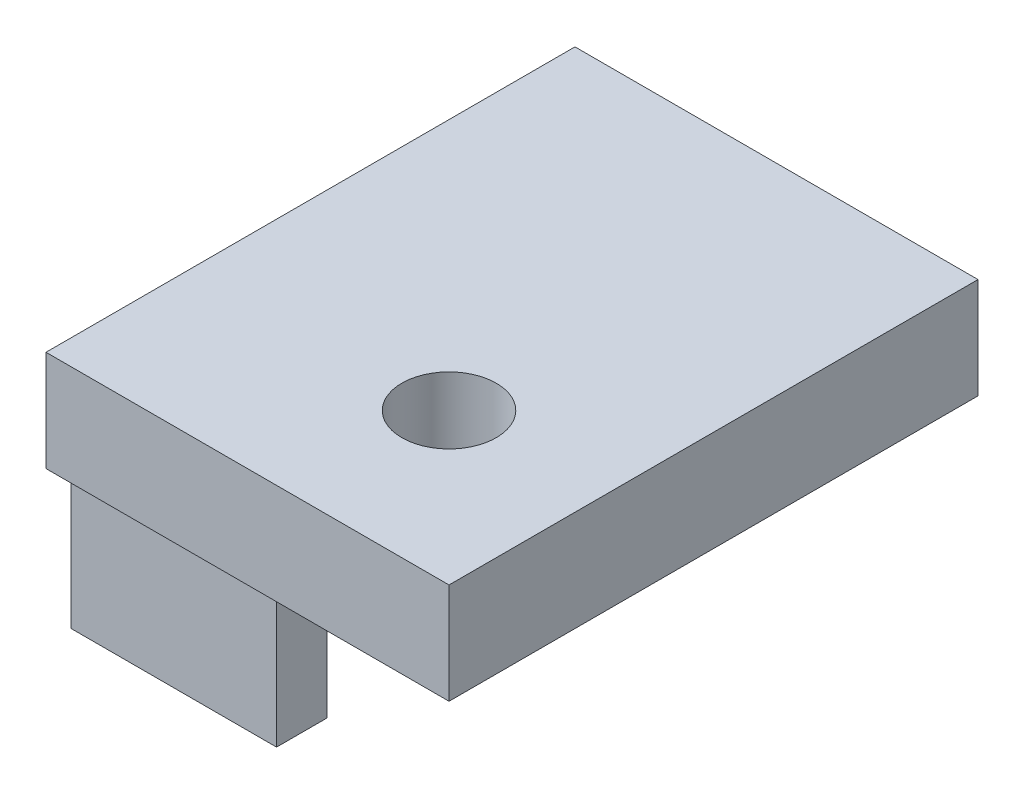
ISO-10303-21;
HEADER;
FILE_DESCRIPTION(('STEP AP214'),'2;1');
FILE_NAME('part.step','',(''),(''),'','','');
FILE_SCHEMA(('AUTOMOTIVE_DESIGN { 1 0 10303 214 1 1 1 1 }'));
ENDSEC;
DATA;
#1=APPLICATION_CONTEXT('core data for automotive mechanical design processes');
#2=APPLICATION_PROTOCOL_DEFINITION('international standard','automotive_design',2000,#1);
#3=PRODUCT_CONTEXT('',#1,'mechanical');
#4=PRODUCT('Part','Part','',(#3));
#5=PRODUCT_RELATED_PRODUCT_CATEGORY('part','',(#4));
#6=PRODUCT_DEFINITION_FORMATION('','',#4);
#7=PRODUCT_DEFINITION_CONTEXT('part definition',#1,'design');
#8=PRODUCT_DEFINITION('design','',#6,#7);
#9=PRODUCT_DEFINITION_SHAPE('','',#8);
#10=(LENGTH_UNIT() NAMED_UNIT(*) SI_UNIT(.MILLI.,.METRE.));
#11=(NAMED_UNIT(*) PLANE_ANGLE_UNIT() SI_UNIT($,.RADIAN.));
#12=(NAMED_UNIT(*) SI_UNIT($,.STERADIAN.) SOLID_ANGLE_UNIT());
#13=UNCERTAINTY_MEASURE_WITH_UNIT(LENGTH_MEASURE(1.E-05),#10,'distance_accuracy_value','');
#14=(GEOMETRIC_REPRESENTATION_CONTEXT(3) GLOBAL_UNCERTAINTY_ASSIGNED_CONTEXT((#13)) GLOBAL_UNIT_ASSIGNED_CONTEXT((#10,
#11,#12)) REPRESENTATION_CONTEXT('',''));
#15=CARTESIAN_POINT('',(0.,0.,0.));
#16=DIRECTION('',(0.,0.,1.));
#17=DIRECTION('',(1.,0.,0.));
#18=AXIS2_PLACEMENT_3D('',#15,#16,#17);
#19=CARTESIAN_POINT('',(0.,0.,0.));
#20=DIRECTION('',(0.,1.,0.));
#21=DIRECTION('',(0.,0.,1.));
#22=AXIS2_PLACEMENT_3D('',#19,#20,#21);
#23=PLANE('',#22);
#24=CARTESIAN_POINT('',(4.8,0.,12.));
#25=DIRECTION('',(0.,1.,0.));
#26=DIRECTION('',(0.,0.,1.));
#27=AXIS2_PLACEMENT_3D('',#24,#25,#26);
#28=CIRCLE('',#27,1.5);
#29=CARTESIAN_POINT('',(4.8,0.,13.5));
#30=VERTEX_POINT('',#29);
#31=EDGE_CURVE('E185',#30,#30,#28,.T.);
#32=ORIENTED_EDGE('',*,*,#31,.T.);
#33=EDGE_LOOP('',(#32));
#34=FACE_BOUND('',#33,.T.);
#35=DIRECTION('',(0.,0.,1.));
#36=VECTOR('',#35,1.);
#37=CARTESIAN_POINT('',(3.08955699171065,0.,0.));
#38=LINE('',#37,#36);
#39=CARTESIAN_POINT('',(3.08955699171065,0.,0.));
#40=VERTEX_POINT('',#39);
#41=CARTESIAN_POINT('',(3.08955699171065,0.,1.6));
#42=VERTEX_POINT('',#41);
#43=EDGE_CURVE('E143',#40,#42,#38,.T.);
#44=ORIENTED_EDGE('',*,*,#43,.F.);
#45=DIRECTION('',(-1.,0.,0.));
#46=VECTOR('',#45,1.);
#47=CARTESIAN_POINT('',(0.,0.,0.));
#48=LINE('',#47,#46);
#49=CARTESIAN_POINT('',(9.6,0.,0.));
#50=VERTEX_POINT('',#49);
#51=EDGE_CURVE('E195',#50,#40,#48,.T.);
#52=ORIENTED_EDGE('',*,*,#51,.F.);
#53=DIRECTION('',(0.,0.,-1.));
#54=VECTOR('',#53,1.);
#55=CARTESIAN_POINT('',(9.6,0.,0.));
#56=LINE('',#55,#54);
#57=CARTESIAN_POINT('',(9.6,0.,16.8));
#58=VERTEX_POINT('',#57);
#59=EDGE_CURVE('E200',#58,#50,#56,.T.);
#60=ORIENTED_EDGE('',*,*,#59,.F.);
#61=DIRECTION('',(1.,0.,0.));
#62=VECTOR('',#61,1.);
#63=CARTESIAN_POINT('',(0.,0.,16.8));
#64=LINE('',#63,#62);
#65=CARTESIAN_POINT('',(-3.2,0.,16.8));
#66=VERTEX_POINT('',#65);
#67=EDGE_CURVE('E189',#66,#58,#64,.T.);
#68=ORIENTED_EDGE('',*,*,#67,.F.);
#69=DIRECTION('',(0.,0.,1.));
#70=VECTOR('',#69,1.);
#71=CARTESIAN_POINT('',(-3.2,0.,0.));
#72=LINE('',#71,#70);
#73=CARTESIAN_POINT('',(-3.2,0.,16.));
#74=VERTEX_POINT('',#73);
#75=EDGE_CURVE('E126',#74,#66,#72,.T.);
#76=ORIENTED_EDGE('',*,*,#75,.F.);
#77=DIRECTION('',(-1.,0.,0.));
#78=VECTOR('',#77,1.);
#79=CARTESIAN_POINT('',(-3.2,0.,16.));
#80=LINE('',#79,#78);
#81=CARTESIAN_POINT('',(3.32222859415942,0.,16.));
#82=VERTEX_POINT('',#81);
#83=EDGE_CURVE('E56',#82,#74,#80,.T.);
#84=ORIENTED_EDGE('',*,*,#83,.F.);
#85=DIRECTION('',(0.,0.,1.));
#86=VECTOR('',#85,1.);
#87=CARTESIAN_POINT('',(3.32222859415942,0.,14.4));
#88=LINE('',#87,#86);
#89=CARTESIAN_POINT('',(3.32222859415942,0.,14.4));
#90=VERTEX_POINT('',#89);
#91=EDGE_CURVE('E167',#90,#82,#88,.T.);
#92=ORIENTED_EDGE('',*,*,#91,.F.);
#93=DIRECTION('',(1.,0.,0.));
#94=VECTOR('',#93,1.);
#95=CARTESIAN_POINT('',(-3.2,0.,14.4));
#96=LINE('',#95,#94);
#97=CARTESIAN_POINT('',(-3.2,0.,14.4));
#98=VERTEX_POINT('',#97);
#99=EDGE_CURVE('E154',#98,#90,#96,.T.);
#100=ORIENTED_EDGE('',*,*,#99,.F.);
#101=CARTESIAN_POINT('',(-3.2,0.,1.6));
#102=VERTEX_POINT('',#101);
#103=EDGE_CURVE('E180',#102,#98,#72,.T.);
#104=ORIENTED_EDGE('',*,*,#103,.F.);
#105=DIRECTION('',(-1.,0.,0.));
#106=VECTOR('',#105,1.);
#107=CARTESIAN_POINT('',(-3.2,0.,1.6));
#108=LINE('',#107,#106);
#109=EDGE_CURVE('E141',#42,#102,#108,.T.);
#110=ORIENTED_EDGE('',*,*,#109,.F.);
#111=EDGE_LOOP('',(#44,#52,#60,#68,#76,#84,#92,#100,#104,#110));
#112=FACE_BOUND('',#111,.T.);
#113=ADVANCED_FACE('F33',(#34,#112),#23,.F.);
#114=CARTESIAN_POINT('',(0.,3.2,0.));
#115=DIRECTION('',(0.,1.,0.));
#116=DIRECTION('',(0.,0.,1.));
#117=AXIS2_PLACEMENT_3D('',#114,#115,#116);
#118=PLANE('',#117);
#119=DIRECTION('',(-1.,0.,0.));
#120=VECTOR('',#119,1.);
#121=CARTESIAN_POINT('',(0.,3.2,0.));
#122=LINE('',#121,#120);
#123=CARTESIAN_POINT('',(9.6,3.2,0.));
#124=VERTEX_POINT('',#123);
#125=CARTESIAN_POINT('',(-3.2,3.2,0.));
#126=VERTEX_POINT('',#125);
#127=EDGE_CURVE('E197',#124,#126,#122,.T.);
#128=ORIENTED_EDGE('',*,*,#127,.T.);
#129=DIRECTION('',(0.,0.,-1.));
#130=VECTOR('',#129,1.);
#131=CARTESIAN_POINT('',(-3.2,3.2,0.));
#132=LINE('',#131,#130);
#133=CARTESIAN_POINT('',(-3.2,3.2,16.8));
#134=VERTEX_POINT('',#133);
#135=EDGE_CURVE('E123',#134,#126,#132,.T.);
#136=ORIENTED_EDGE('',*,*,#135,.F.);
#137=DIRECTION('',(1.,0.,0.));
#138=VECTOR('',#137,1.);
#139=CARTESIAN_POINT('',(0.,3.2,16.8));
#140=LINE('',#139,#138);
#141=CARTESIAN_POINT('',(9.6,3.2,16.8));
#142=VERTEX_POINT('',#141);
#143=EDGE_CURVE('E192',#134,#142,#140,.T.);
#144=ORIENTED_EDGE('',*,*,#143,.T.);
#145=DIRECTION('',(0.,0.,-1.));
#146=VECTOR('',#145,1.);
#147=CARTESIAN_POINT('',(9.6,3.2,0.));
#148=LINE('',#147,#146);
#149=EDGE_CURVE('E194',#142,#124,#148,.T.);
#150=ORIENTED_EDGE('',*,*,#149,.T.);
#151=EDGE_LOOP('',(#128,#136,#144,#150));
#152=FACE_BOUND('',#151,.T.);
#153=CARTESIAN_POINT('',(4.8,3.2,12.));
#154=DIRECTION('',(0.,1.,0.));
#155=DIRECTION('',(0.,0.,1.));
#156=AXIS2_PLACEMENT_3D('',#153,#154,#155);
#157=CIRCLE('',#156,1.5);
#158=CARTESIAN_POINT('',(4.8,3.2,13.5));
#159=VERTEX_POINT('',#158);
#160=EDGE_CURVE('E186',#159,#159,#157,.T.);
#161=ORIENTED_EDGE('',*,*,#160,.F.);
#162=EDGE_LOOP('',(#161));
#163=FACE_BOUND('',#162,.T.);
#164=ADVANCED_FACE('F235',(#152,#163),#118,.T.);
#165=CARTESIAN_POINT('',(0.,3.2,16.8));
#166=DIRECTION('',(0.,0.,-1.));
#167=DIRECTION('',(-1.,0.,0.));
#168=AXIS2_PLACEMENT_3D('',#165,#166,#167);
#169=PLANE('',#168);
#170=ORIENTED_EDGE('',*,*,#67,.T.);
#171=DIRECTION('',(0.,-1.,0.));
#172=VECTOR('',#171,1.);
#173=CARTESIAN_POINT('',(9.6,3.2,16.8));
#174=LINE('',#173,#172);
#175=EDGE_CURVE('E11',#142,#58,#174,.T.);
#176=ORIENTED_EDGE('',*,*,#175,.F.);
#177=ORIENTED_EDGE('',*,*,#143,.F.);
#178=DIRECTION('',(0.,1.,0.));
#179=VECTOR('',#178,1.);
#180=CARTESIAN_POINT('',(-3.2,0.,16.8));
#181=LINE('',#180,#179);
#182=EDGE_CURVE('E182',#66,#134,#181,.T.);
#183=ORIENTED_EDGE('',*,*,#182,.F.);
#184=EDGE_LOOP('',(#170,#176,#177,#183));
#185=FACE_BOUND('',#184,.T.);
#186=ADVANCED_FACE('F35',(#185),#169,.F.);
#187=CARTESIAN_POINT('',(9.6,3.2,0.));
#188=DIRECTION('',(-1.,0.,0.));
#189=DIRECTION('',(0.,0.,1.));
#190=AXIS2_PLACEMENT_3D('',#187,#188,#189);
#191=PLANE('',#190);
#192=ORIENTED_EDGE('',*,*,#59,.T.);
#193=DIRECTION('',(0.,-1.,0.));
#194=VECTOR('',#193,1.);
#195=CARTESIAN_POINT('',(9.6,3.2,0.));
#196=LINE('',#195,#194);
#197=EDGE_CURVE('E41',#124,#50,#196,.T.);
#198=ORIENTED_EDGE('',*,*,#197,.F.);
#199=ORIENTED_EDGE('',*,*,#149,.F.);
#200=ORIENTED_EDGE('',*,*,#175,.T.);
#201=EDGE_LOOP('',(#192,#198,#199,#200));
#202=FACE_BOUND('',#201,.T.);
#203=ADVANCED_FACE('F237',(#202),#191,.F.);
#204=CARTESIAN_POINT('',(0.,3.2,0.));
#205=DIRECTION('',(0.,0.,1.));
#206=DIRECTION('',(1.,0.,0.));
#207=AXIS2_PLACEMENT_3D('',#204,#205,#206);
#208=PLANE('',#207);
#209=ORIENTED_EDGE('',*,*,#51,.T.);
#210=DIRECTION('',(0.,1.,0.));
#211=VECTOR('',#210,1.);
#212=CARTESIAN_POINT('',(3.08955699171065,-4.8,0.));
#213=LINE('',#212,#211);
#214=CARTESIAN_POINT('',(3.08955699171065,-4.8,0.));
#215=VERTEX_POINT('',#214);
#216=EDGE_CURVE('E133',#215,#40,#213,.T.);
#217=ORIENTED_EDGE('',*,*,#216,.F.);
#218=DIRECTION('',(1.,0.,0.));
#219=VECTOR('',#218,1.);
#220=CARTESIAN_POINT('',(-3.2,-4.8,0.));
#221=LINE('',#220,#219);
#222=CARTESIAN_POINT('',(-3.2,-4.8,0.));
#223=VERTEX_POINT('',#222);
#224=EDGE_CURVE('E130',#223,#215,#221,.T.);
#225=ORIENTED_EDGE('',*,*,#224,.F.);
#226=DIRECTION('',(0.,-1.,0.));
#227=VECTOR('',#226,1.);
#228=CARTESIAN_POINT('',(-3.2,0.,0.));
#229=LINE('',#228,#227);
#230=EDGE_CURVE('E116',#126,#223,#229,.T.);
#231=ORIENTED_EDGE('',*,*,#230,.F.);
#232=ORIENTED_EDGE('',*,*,#127,.F.);
#233=ORIENTED_EDGE('',*,*,#197,.T.);
#234=EDGE_LOOP('',(#209,#217,#225,#231,#232,#233));
#235=FACE_BOUND('',#234,.T.);
#236=ADVANCED_FACE('F132',(#235),#208,.F.);
#237=CARTESIAN_POINT('',(4.8,3.2,12.));
#238=DIRECTION('',(0.,-1.,0.));
#239=DIRECTION('',(0.,0.,-1.));
#240=AXIS2_PLACEMENT_3D('',#237,#238,#239);
#241=CYLINDRICAL_SURFACE('',#240,1.5);
#242=ORIENTED_EDGE('',*,*,#160,.T.);
#243=EDGE_LOOP('',(#242));
#244=FACE_BOUND('',#243,.T.);
#245=ORIENTED_EDGE('',*,*,#31,.F.);
#246=EDGE_LOOP('',(#245));
#247=FACE_BOUND('',#246,.T.);
#248=ADVANCED_FACE('F243',(#244,#247),#241,.F.);
#249=CARTESIAN_POINT('',(-3.2,0.,0.));
#250=DIRECTION('',(1.,0.,0.));
#251=DIRECTION('',(0.,0.,-1.));
#252=AXIS2_PLACEMENT_3D('',#249,#250,#251);
#253=PLANE('',#252);
#254=ORIENTED_EDGE('',*,*,#230,.T.);
#255=DIRECTION('',(0.,0.,-1.));
#256=VECTOR('',#255,1.);
#257=CARTESIAN_POINT('',(-3.2,-4.8,0.));
#258=LINE('',#257,#256);
#259=CARTESIAN_POINT('',(-3.2,-4.8,1.6));
#260=VERTEX_POINT('',#259);
#261=EDGE_CURVE('E120',#260,#223,#258,.T.);
#262=ORIENTED_EDGE('',*,*,#261,.F.);
#263=DIRECTION('',(0.,1.,0.));
#264=VECTOR('',#263,1.);
#265=CARTESIAN_POINT('',(-3.2,-4.8,1.6));
#266=LINE('',#265,#264);
#267=EDGE_CURVE('E48',#260,#102,#266,.T.);
#268=ORIENTED_EDGE('',*,*,#267,.T.);
#269=ORIENTED_EDGE('',*,*,#103,.T.);
#270=DIRECTION('',(0.,1.,0.));
#271=VECTOR('',#270,1.);
#272=CARTESIAN_POINT('',(-3.2,-4.8,14.4));
#273=LINE('',#272,#271);
#274=CARTESIAN_POINT('',(-3.2,-4.8,14.4));
#275=VERTEX_POINT('',#274);
#276=EDGE_CURVE('E127',#275,#98,#273,.T.);
#277=ORIENTED_EDGE('',*,*,#276,.F.);
#278=DIRECTION('',(0.,0.,-1.));
#279=VECTOR('',#278,1.);
#280=CARTESIAN_POINT('',(-3.2,-4.8,14.4));
#281=LINE('',#280,#279);
#282=CARTESIAN_POINT('',(-3.2,-4.8,16.));
#283=VERTEX_POINT('',#282);
#284=EDGE_CURVE('E155',#283,#275,#281,.T.);
#285=ORIENTED_EDGE('',*,*,#284,.F.);
#286=DIRECTION('',(0.,1.,0.));
#287=VECTOR('',#286,1.);
#288=CARTESIAN_POINT('',(-3.2,-4.8,16.));
#289=LINE('',#288,#287);
#290=EDGE_CURVE('E164',#283,#74,#289,.T.);
#291=ORIENTED_EDGE('',*,*,#290,.T.);
#292=ORIENTED_EDGE('',*,*,#75,.T.);
#293=ORIENTED_EDGE('',*,*,#182,.T.);
#294=ORIENTED_EDGE('',*,*,#135,.T.);
#295=EDGE_LOOP('',(#254,#262,#268,#269,#277,#285,#291,#292,#293,#294));
#296=FACE_BOUND('',#295,.T.);
#297=ADVANCED_FACE('F118',(#296),#253,.F.);
#298=CARTESIAN_POINT('',(-3.2,-4.8,14.4));
#299=DIRECTION('',(0.,0.,1.));
#300=DIRECTION('',(1.,0.,0.));
#301=AXIS2_PLACEMENT_3D('',#298,#299,#300);
#302=PLANE('',#301);
#303=ORIENTED_EDGE('',*,*,#99,.T.);
#304=DIRECTION('',(0.,1.,0.));
#305=VECTOR('',#304,1.);
#306=CARTESIAN_POINT('',(3.32222859415942,-4.8,14.4));
#307=LINE('',#306,#305);
#308=CARTESIAN_POINT('',(3.32222859415942,-4.8,14.4));
#309=VERTEX_POINT('',#308);
#310=EDGE_CURVE('E175',#309,#90,#307,.T.);
#311=ORIENTED_EDGE('',*,*,#310,.F.);
#312=DIRECTION('',(1.,0.,0.));
#313=VECTOR('',#312,1.);
#314=CARTESIAN_POINT('',(-3.2,-4.8,14.4));
#315=LINE('',#314,#313);
#316=EDGE_CURVE('E158',#275,#309,#315,.T.);
#317=ORIENTED_EDGE('',*,*,#316,.F.);
#318=ORIENTED_EDGE('',*,*,#276,.T.);
#319=EDGE_LOOP('',(#303,#311,#317,#318));
#320=FACE_BOUND('',#319,.T.);
#321=ADVANCED_FACE('F221',(#320),#302,.F.);
#322=CARTESIAN_POINT('',(3.32222859415942,-4.8,14.4));
#323=DIRECTION('',(-1.,0.,0.));
#324=DIRECTION('',(0.,0.,1.));
#325=AXIS2_PLACEMENT_3D('',#322,#323,#324);
#326=PLANE('',#325);
#327=ORIENTED_EDGE('',*,*,#91,.T.);
#328=DIRECTION('',(0.,1.,0.));
#329=VECTOR('',#328,1.);
#330=CARTESIAN_POINT('',(3.32222859415942,-4.8,16.));
#331=LINE('',#330,#329);
#332=CARTESIAN_POINT('',(3.32222859415942,-4.8,16.));
#333=VERTEX_POINT('',#332);
#334=EDGE_CURVE('E172',#333,#82,#331,.T.);
#335=ORIENTED_EDGE('',*,*,#334,.F.);
#336=DIRECTION('',(0.,0.,1.));
#337=VECTOR('',#336,1.);
#338=CARTESIAN_POINT('',(3.32222859415942,-4.8,14.4));
#339=LINE('',#338,#337);
#340=EDGE_CURVE('E160',#309,#333,#339,.T.);
#341=ORIENTED_EDGE('',*,*,#340,.F.);
#342=ORIENTED_EDGE('',*,*,#310,.T.);
#343=EDGE_LOOP('',(#327,#335,#341,#342));
#344=FACE_BOUND('',#343,.T.);
#345=ADVANCED_FACE('F260',(#344),#326,.F.);
#346=CARTESIAN_POINT('',(-3.2,-4.8,16.));
#347=DIRECTION('',(0.,0.,-1.));
#348=DIRECTION('',(-1.,0.,0.));
#349=AXIS2_PLACEMENT_3D('',#346,#347,#348);
#350=PLANE('',#349);
#351=ORIENTED_EDGE('',*,*,#83,.T.);
#352=ORIENTED_EDGE('',*,*,#290,.F.);
#353=DIRECTION('',(-1.,0.,0.));
#354=VECTOR('',#353,1.);
#355=CARTESIAN_POINT('',(-3.2,-4.8,16.));
#356=LINE('',#355,#354);
#357=EDGE_CURVE('E162',#333,#283,#356,.T.);
#358=ORIENTED_EDGE('',*,*,#357,.F.);
#359=ORIENTED_EDGE('',*,*,#334,.T.);
#360=EDGE_LOOP('',(#351,#352,#358,#359));
#361=FACE_BOUND('',#360,.T.);
#362=ADVANCED_FACE('F230',(#361),#350,.F.);
#363=CARTESIAN_POINT('',(0.,-4.8,0.));
#364=DIRECTION('',(0.,1.,0.));
#365=DIRECTION('',(0.,0.,1.));
#366=AXIS2_PLACEMENT_3D('',#363,#364,#365);
#367=PLANE('',#366);
#368=ORIENTED_EDGE('',*,*,#284,.T.);
#369=ORIENTED_EDGE('',*,*,#316,.T.);
#370=ORIENTED_EDGE('',*,*,#340,.T.);
#371=ORIENTED_EDGE('',*,*,#357,.T.);
#372=EDGE_LOOP('',(#368,#369,#370,#371));
#373=FACE_BOUND('',#372,.T.);
#374=ADVANCED_FACE('F225',(#373),#367,.F.);
#375=CARTESIAN_POINT('',(3.08955699171065,-4.8,0.));
#376=DIRECTION('',(-1.,0.,0.));
#377=DIRECTION('',(0.,0.,1.));
#378=AXIS2_PLACEMENT_3D('',#375,#376,#377);
#379=PLANE('',#378);
#380=ORIENTED_EDGE('',*,*,#43,.T.);
#381=DIRECTION('',(0.,1.,0.));
#382=VECTOR('',#381,1.);
#383=CARTESIAN_POINT('',(3.08955699171065,-4.8,1.6));
#384=LINE('',#383,#382);
#385=CARTESIAN_POINT('',(3.08955699171065,-4.8,1.6));
#386=VERTEX_POINT('',#385);
#387=EDGE_CURVE('E150',#386,#42,#384,.T.);
#388=ORIENTED_EDGE('',*,*,#387,.F.);
#389=DIRECTION('',(0.,0.,1.));
#390=VECTOR('',#389,1.);
#391=CARTESIAN_POINT('',(3.08955699171065,-4.8,0.));
#392=LINE('',#391,#390);
#393=EDGE_CURVE('E136',#215,#386,#392,.T.);
#394=ORIENTED_EDGE('',*,*,#393,.F.);
#395=ORIENTED_EDGE('',*,*,#216,.T.);
#396=EDGE_LOOP('',(#380,#388,#394,#395));
#397=FACE_BOUND('',#396,.T.);
#398=ADVANCED_FACE('F214',(#397),#379,.F.);
#399=CARTESIAN_POINT('',(-3.2,-4.8,1.6));
#400=DIRECTION('',(0.,0.,-1.));
#401=DIRECTION('',(-1.,0.,0.));
#402=AXIS2_PLACEMENT_3D('',#399,#400,#401);
#403=PLANE('',#402);
#404=ORIENTED_EDGE('',*,*,#109,.T.);
#405=ORIENTED_EDGE('',*,*,#267,.F.);
#406=DIRECTION('',(-1.,0.,0.));
#407=VECTOR('',#406,1.);
#408=CARTESIAN_POINT('',(-3.2,-4.8,1.6));
#409=LINE('',#408,#407);
#410=EDGE_CURVE('E140',#386,#260,#409,.T.);
#411=ORIENTED_EDGE('',*,*,#410,.F.);
#412=ORIENTED_EDGE('',*,*,#387,.T.);
#413=EDGE_LOOP('',(#404,#405,#411,#412));
#414=FACE_BOUND('',#413,.T.);
#415=ADVANCED_FACE('F216',(#414),#403,.F.);
#416=CARTESIAN_POINT('',(0.,-4.8,0.));
#417=DIRECTION('',(0.,1.,0.));
#418=DIRECTION('',(0.,0.,1.));
#419=AXIS2_PLACEMENT_3D('',#416,#417,#418);
#420=PLANE('',#419);
#421=ORIENTED_EDGE('',*,*,#261,.T.);
#422=ORIENTED_EDGE('',*,*,#224,.T.);
#423=ORIENTED_EDGE('',*,*,#393,.T.);
#424=ORIENTED_EDGE('',*,*,#410,.T.);
#425=EDGE_LOOP('',(#421,#422,#423,#424));
#426=FACE_BOUND('',#425,.T.);
#427=ADVANCED_FACE('F138',(#426),#420,.F.);
#428=CLOSED_SHELL('',(#113,#164,#186,#203,#236,#248,#297,#321,#345,#362,#374,#398,#415,#427));
#429=MANIFOLD_SOLID_BREP('B2',#428);
#430=ADVANCED_BREP_SHAPE_REPRESENTATION('',(#18,#429),#14);
#431=SHAPE_DEFINITION_REPRESENTATION(#9,#430);
ENDSEC;
END-ISO-10303-21;
